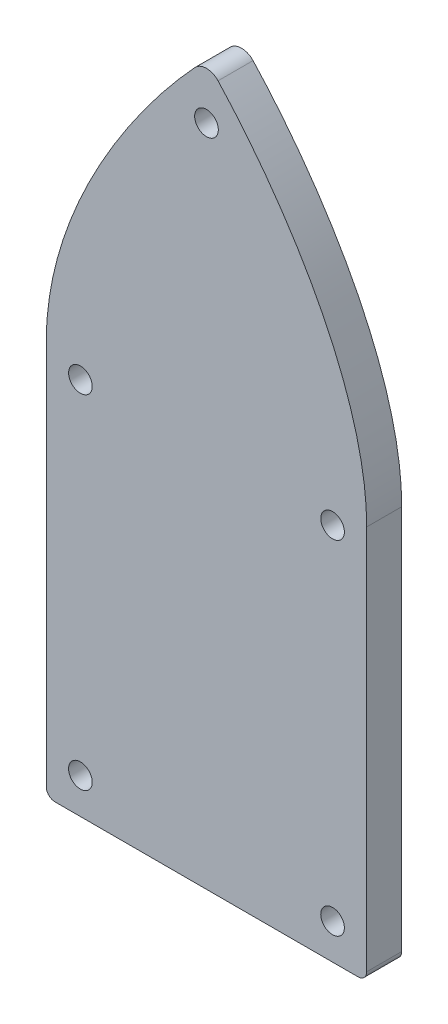
ISO-10303-21;
HEADER;
FILE_DESCRIPTION(('STEP AP214'),'2;1');
FILE_NAME('part.step','',(''),(''),'','','');
FILE_SCHEMA(('AUTOMOTIVE_DESIGN { 1 0 10303 214 1 1 1 1 }'));
ENDSEC;
DATA;
#1=APPLICATION_CONTEXT('core data for automotive mechanical design processes');
#2=APPLICATION_PROTOCOL_DEFINITION('international standard','automotive_design',2000,#1);
#3=PRODUCT_CONTEXT('',#1,'mechanical');
#4=PRODUCT('Part','Part','',(#3));
#5=PRODUCT_RELATED_PRODUCT_CATEGORY('part','',(#4));
#6=PRODUCT_DEFINITION_FORMATION('','',#4);
#7=PRODUCT_DEFINITION_CONTEXT('part definition',#1,'design');
#8=PRODUCT_DEFINITION('design','',#6,#7);
#9=PRODUCT_DEFINITION_SHAPE('','',#8);
#10=(LENGTH_UNIT() NAMED_UNIT(*) SI_UNIT(.MILLI.,.METRE.));
#11=(NAMED_UNIT(*) PLANE_ANGLE_UNIT() SI_UNIT($,.RADIAN.));
#12=(NAMED_UNIT(*) SI_UNIT($,.STERADIAN.) SOLID_ANGLE_UNIT());
#13=UNCERTAINTY_MEASURE_WITH_UNIT(LENGTH_MEASURE(1.E-05),#10,'distance_accuracy_value','');
#14=(GEOMETRIC_REPRESENTATION_CONTEXT(3) GLOBAL_UNCERTAINTY_ASSIGNED_CONTEXT((#13)) GLOBAL_UNIT_ASSIGNED_CONTEXT((#10,
#11,#12)) REPRESENTATION_CONTEXT('',''));
#15=CARTESIAN_POINT('',(0.,0.,0.));
#16=DIRECTION('',(0.,0.,1.));
#17=DIRECTION('',(1.,0.,0.));
#18=AXIS2_PLACEMENT_3D('',#15,#16,#17);
#19=CARTESIAN_POINT('',(-11.5364853865046,65.5385146134954,0.));
#20=DIRECTION('',(0.,0.,1.));
#21=DIRECTION('',(1.,0.,0.));
#22=AXIS2_PLACEMENT_3D('',#19,#20,#21);
#23=PLANE('',#22);
#24=CARTESIAN_POINT('',(-14.4,42.0178344238091,0.));
#25=DIRECTION('',(0.,0.,-1.));
#26=DIRECTION('',(-1.,0.,0.));
#27=AXIS2_PLACEMENT_3D('',#24,#25,#26);
#28=CIRCLE('',#27,2.5);
#29=CARTESIAN_POINT('',(-16.9,42.0178344238091,0.));
#30=VERTEX_POINT('',#29);
#31=EDGE_CURVE('E308',#30,#30,#28,.T.);
#32=ORIENTED_EDGE('',*,*,#31,.F.);
#33=EDGE_LOOP('',(#32));
#34=FACE_BOUND('',#33,.T.);
#35=CARTESIAN_POINT('',(0.,74.6,0.));
#36=DIRECTION('',(0.,0.,-1.));
#37=DIRECTION('',(-1.,0.,0.));
#38=AXIS2_PLACEMENT_3D('',#35,#36,#37);
#39=CIRCLE('',#38,2.5);
#40=CARTESIAN_POINT('',(-2.5,74.6,0.));
#41=VERTEX_POINT('',#40);
#42=EDGE_CURVE('E358',#41,#41,#39,.T.);
#43=ORIENTED_EDGE('',*,*,#42,.F.);
#44=EDGE_LOOP('',(#43));
#45=FACE_BOUND('',#44,.T.);
#46=DIRECTION('',(0.,1.,0.));
#47=VECTOR('',#46,1.);
#48=CARTESIAN_POINT('',(18.3,-1.2,0.));
#49=LINE('',#48,#47);
#50=CARTESIAN_POINT('',(18.3,-0.2,0.));
#51=VERTEX_POINT('',#50);
#52=CARTESIAN_POINT('',(18.3,43.8,0.));
#53=VERTEX_POINT('',#52);
#54=EDGE_CURVE('E226',#51,#53,#49,.T.);
#55=ORIENTED_EDGE('',*,*,#54,.F.);
#56=CARTESIAN_POINT('',(17.3,-0.2,0.));
#57=DIRECTION('',(0.,0.,1.));
#58=DIRECTION('',(1.,0.,0.));
#59=AXIS2_PLACEMENT_3D('',#56,#57,#58);
#60=CIRCLE('',#59,1.);
#61=CARTESIAN_POINT('',(17.3,-1.2,0.));
#62=VERTEX_POINT('',#61);
#63=EDGE_CURVE('E194',#51,#62,#60,.F.);
#64=ORIENTED_EDGE('',*,*,#63,.T.);
#65=DIRECTION('',(1.,0.,0.));
#66=VECTOR('',#65,1.);
#67=CARTESIAN_POINT('',(-18.3,-1.2,0.));
#68=LINE('',#67,#66);
#69=CARTESIAN_POINT('',(-17.3,-1.2,0.));
#70=VERTEX_POINT('',#69);
#71=EDGE_CURVE('E224',#70,#62,#68,.T.);
#72=ORIENTED_EDGE('',*,*,#71,.F.);
#73=CARTESIAN_POINT('',(-17.3,-0.2,0.));
#74=DIRECTION('',(0.,0.,1.));
#75=DIRECTION('',(1.,0.,0.));
#76=AXIS2_PLACEMENT_3D('',#73,#74,#75);
#77=CIRCLE('',#76,1.);
#78=CARTESIAN_POINT('',(-18.3,-0.2,0.));
#79=VERTEX_POINT('',#78);
#80=EDGE_CURVE('E192',#70,#79,#77,.F.);
#81=ORIENTED_EDGE('',*,*,#80,.T.);
#82=DIRECTION('',(0.,-1.,0.));
#83=VECTOR('',#82,1.);
#84=CARTESIAN_POINT('',(-18.3,-1.2,0.));
#85=LINE('',#84,#83);
#86=CARTESIAN_POINT('',(-18.3,43.8,0.));
#87=VERTEX_POINT('',#86);
#88=EDGE_CURVE('E229',#87,#79,#85,.T.);
#89=ORIENTED_EDGE('',*,*,#88,.F.);
#90=CARTESIAN_POINT('',(0.,80.8,0.));
#91=CARTESIAN_POINT('',(-6.36396103067883,74.4360389693211,0.));
#92=CARTESIAN_POINT('',(-18.3,58.8,0.));
#93=CARTESIAN_POINT('',(-18.3,43.8,0.));
#94=B_SPLINE_CURVE_WITH_KNOTS('',3,(#90,#91,#92,#93),.UNSPECIFIED.,.F.,.F.,(4,4),(0.,1.),.UNSPECIFIED.);
#95=CARTESIAN_POINT('',(-1.31719415240125,79.4330573062065,0.));
#96=VERTEX_POINT('',#95);
#97=EDGE_CURVE('E233',#96,#87,#94,.T.);
#98=ORIENTED_EDGE('',*,*,#97,.F.);
#99=CARTESIAN_POINT('',(0.,78.2062730689097,0.));
#100=DIRECTION('',(0.,0.,1.));
#101=DIRECTION('',(1.,0.,0.));
#102=AXIS2_PLACEMENT_3D('',#99,#100,#101);
#103=CIRCLE('',#102,1.8);
#104=CARTESIAN_POINT('',(1.31719415240124,79.4330573062065,0.));
#105=VERTEX_POINT('',#104);
#106=EDGE_CURVE('E179',#96,#105,#103,.F.);
#107=ORIENTED_EDGE('',*,*,#106,.T.);
#108=CARTESIAN_POINT('',(18.3,43.8,0.));
#109=CARTESIAN_POINT('',(18.3,58.8,0.));
#110=CARTESIAN_POINT('',(6.36396103067883,74.4360389693211,0.));
#111=CARTESIAN_POINT('',(0.,80.8,0.));
#112=B_SPLINE_CURVE_WITH_KNOTS('',3,(#108,#109,#110,#111),.UNSPECIFIED.,.F.,.F.,(4,4),(0.,1.),.UNSPECIFIED.);
#113=EDGE_CURVE('E231',#53,#105,#112,.T.);
#114=ORIENTED_EDGE('',*,*,#113,.F.);
#115=EDGE_LOOP('',(#55,#64,#72,#81,#89,#98,#107,#114));
#116=FACE_BOUND('',#115,.T.);
#117=CARTESIAN_POINT('',(14.4,42.0178344238091,0.));
#118=DIRECTION('',(0.,0.,-1.));
#119=DIRECTION('',(-1.,0.,0.));
#120=AXIS2_PLACEMENT_3D('',#117,#118,#119);
#121=CIRCLE('',#120,2.5);
#122=CARTESIAN_POINT('',(11.9,42.0178344238091,0.));
#123=VERTEX_POINT('',#122);
#124=EDGE_CURVE('E346',#123,#123,#121,.T.);
#125=ORIENTED_EDGE('',*,*,#124,.F.);
#126=EDGE_LOOP('',(#125));
#127=FACE_BOUND('',#126,.T.);
#128=CARTESIAN_POINT('',(14.4,2.86352117162364,0.));
#129=DIRECTION('',(0.,0.,-1.));
#130=DIRECTION('',(-1.,0.,0.));
#131=AXIS2_PLACEMENT_3D('',#128,#129,#130);
#132=CIRCLE('',#131,2.5);
#133=CARTESIAN_POINT('',(11.9,2.86352117162364,0.));
#134=VERTEX_POINT('',#133);
#135=EDGE_CURVE('E334',#134,#134,#132,.T.);
#136=ORIENTED_EDGE('',*,*,#135,.F.);
#137=EDGE_LOOP('',(#136));
#138=FACE_BOUND('',#137,.T.);
#139=CARTESIAN_POINT('',(-14.4,2.86352117162364,0.));
#140=DIRECTION('',(0.,0.,-1.));
#141=DIRECTION('',(-1.,0.,0.));
#142=AXIS2_PLACEMENT_3D('',#139,#140,#141);
#143=CIRCLE('',#142,2.5);
#144=CARTESIAN_POINT('',(-16.9,2.86352117162364,0.));
#145=VERTEX_POINT('',#144);
#146=EDGE_CURVE('E322',#145,#145,#143,.T.);
#147=ORIENTED_EDGE('',*,*,#146,.F.);
#148=EDGE_LOOP('',(#147));
#149=FACE_BOUND('',#148,.T.);
#150=DIRECTION('',(1.,0.,0.));
#151=VECTOR('',#150,1.);
#152=CARTESIAN_POINT('',(-11.5364853865046,29.3,0.));
#153=LINE('',#152,#151);
#154=CARTESIAN_POINT('',(3.,29.3,0.));
#155=VERTEX_POINT('',#154);
#156=CARTESIAN_POINT('',(7.,29.3,0.));
#157=VERTEX_POINT('',#156);
#158=EDGE_CURVE('E252',#155,#157,#153,.T.);
#159=ORIENTED_EDGE('',*,*,#158,.T.);
#160=DIRECTION('',(0.,-1.,0.));
#161=VECTOR('',#160,1.);
#162=CARTESIAN_POINT('',(7.,34.8,0.));
#163=LINE('',#162,#161);
#164=CARTESIAN_POINT('',(7.,50.3,0.));
#165=VERTEX_POINT('',#164);
#166=EDGE_CURVE('E292',#165,#157,#163,.T.);
#167=ORIENTED_EDGE('',*,*,#166,.F.);
#168=DIRECTION('',(1.,0.,0.));
#169=VECTOR('',#168,1.);
#170=CARTESIAN_POINT('',(-11.5364853865046,50.3,0.));
#171=LINE('',#170,#169);
#172=CARTESIAN_POINT('',(3.,50.3,0.));
#173=VERTEX_POINT('',#172);
#174=EDGE_CURVE('E249',#165,#173,#171,.F.);
#175=ORIENTED_EDGE('',*,*,#174,.T.);
#176=DIRECTION('',(0.,-1.,0.));
#177=VECTOR('',#176,1.);
#178=CARTESIAN_POINT('',(3.,34.8,0.));
#179=LINE('',#178,#177);
#180=EDGE_CURVE('E295',#173,#155,#179,.T.);
#181=ORIENTED_EDGE('',*,*,#180,.T.);
#182=EDGE_LOOP('',(#159,#167,#175,#181));
#183=FACE_BOUND('',#182,.T.);
#184=DIRECTION('',(0.,-1.,0.));
#185=VECTOR('',#184,1.);
#186=CARTESIAN_POINT('',(-7.,34.8,0.));
#187=LINE('',#186,#185);
#188=CARTESIAN_POINT('',(-7.,50.3,0.));
#189=VERTEX_POINT('',#188);
#190=CARTESIAN_POINT('',(-7.,29.3,0.));
#191=VERTEX_POINT('',#190);
#192=EDGE_CURVE('E275',#189,#191,#187,.T.);
#193=ORIENTED_EDGE('',*,*,#192,.T.);
#194=DIRECTION('',(-1.,0.,0.));
#195=VECTOR('',#194,1.);
#196=CARTESIAN_POINT('',(-3.,29.3,0.));
#197=LINE('',#196,#195);
#198=CARTESIAN_POINT('',(-3.,29.3,0.));
#199=VERTEX_POINT('',#198);
#200=EDGE_CURVE('E266',#191,#199,#197,.F.);
#201=ORIENTED_EDGE('',*,*,#200,.T.);
#202=DIRECTION('',(0.,-1.,0.));
#203=VECTOR('',#202,1.);
#204=CARTESIAN_POINT('',(-3.,34.8,0.));
#205=LINE('',#204,#203);
#206=CARTESIAN_POINT('',(-3.,50.3,0.));
#207=VERTEX_POINT('',#206);
#208=EDGE_CURVE('E161',#207,#199,#205,.T.);
#209=ORIENTED_EDGE('',*,*,#208,.F.);
#210=DIRECTION('',(-1.,0.,0.));
#211=VECTOR('',#210,1.);
#212=CARTESIAN_POINT('',(-7.,50.3,0.));
#213=LINE('',#212,#211);
#214=EDGE_CURVE('E174',#207,#189,#213,.T.);
#215=ORIENTED_EDGE('',*,*,#214,.T.);
#216=EDGE_LOOP('',(#193,#201,#209,#215));
#217=FACE_BOUND('',#216,.T.);
#218=ADVANCED_FACE('F33',(#34,#45,#116,#127,#138,#149,#183,#217),#23,.F.);
#219=CARTESIAN_POINT('',(-11.5364853865046,65.5385146134954,4.));
#220=DIRECTION('',(0.,0.,1.));
#221=DIRECTION('',(1.,0.,0.));
#222=AXIS2_PLACEMENT_3D('',#219,#220,#221);
#223=PLANE('',#222);
#224=CARTESIAN_POINT('',(0.,74.6,4.));
#225=DIRECTION('',(0.,0.,-1.));
#226=DIRECTION('',(-1.,0.,0.));
#227=AXIS2_PLACEMENT_3D('',#224,#225,#226);
#228=CIRCLE('',#227,1.35);
#229=CARTESIAN_POINT('',(-1.35,74.6,4.));
#230=VERTEX_POINT('',#229);
#231=EDGE_CURVE('E367',#230,#230,#228,.T.);
#232=ORIENTED_EDGE('',*,*,#231,.T.);
#233=EDGE_LOOP('',(#232));
#234=FACE_BOUND('',#233,.T.);
#235=DIRECTION('',(1.,0.,0.));
#236=VECTOR('',#235,1.);
#237=CARTESIAN_POINT('',(-18.3,-1.2,4.));
#238=LINE('',#237,#236);
#239=CARTESIAN_POINT('',(-17.3,-1.2,4.));
#240=VERTEX_POINT('',#239);
#241=CARTESIAN_POINT('',(17.3,-1.2,4.));
#242=VERTEX_POINT('',#241);
#243=EDGE_CURVE('E209',#240,#242,#238,.T.);
#244=ORIENTED_EDGE('',*,*,#243,.T.);
#245=CARTESIAN_POINT('',(17.3,-0.2,4.));
#246=DIRECTION('',(0.,0.,1.));
#247=DIRECTION('',(1.,0.,0.));
#248=AXIS2_PLACEMENT_3D('',#245,#246,#247);
#249=CIRCLE('',#248,1.);
#250=CARTESIAN_POINT('',(18.3,-0.2,4.));
#251=VERTEX_POINT('',#250);
#252=EDGE_CURVE('E41',#242,#251,#249,.T.);
#253=ORIENTED_EDGE('',*,*,#252,.T.);
#254=DIRECTION('',(0.,1.,0.));
#255=VECTOR('',#254,1.);
#256=CARTESIAN_POINT('',(18.3,-1.2,4.));
#257=LINE('',#256,#255);
#258=CARTESIAN_POINT('',(18.3,43.8,4.));
#259=VERTEX_POINT('',#258);
#260=EDGE_CURVE('E207',#251,#259,#257,.T.);
#261=ORIENTED_EDGE('',*,*,#260,.T.);
#262=CARTESIAN_POINT('',(18.3,43.8,4.));
#263=CARTESIAN_POINT('',(18.3,58.8,4.));
#264=CARTESIAN_POINT('',(6.36396103067883,74.4360389693211,4.));
#265=CARTESIAN_POINT('',(0.,80.8,4.));
#266=B_SPLINE_CURVE_WITH_KNOTS('',3,(#262,#263,#264,#265),.UNSPECIFIED.,.F.,.F.,(4,4),(0.,1.),.UNSPECIFIED.);
#267=CARTESIAN_POINT('',(1.31719415240124,79.4330573062065,4.));
#268=VERTEX_POINT('',#267);
#269=EDGE_CURVE('E218',#259,#268,#266,.T.);
#270=ORIENTED_EDGE('',*,*,#269,.T.);
#271=CARTESIAN_POINT('',(0.,78.2062730689097,4.));
#272=DIRECTION('',(0.,0.,1.));
#273=DIRECTION('',(1.,0.,0.));
#274=AXIS2_PLACEMENT_3D('',#271,#272,#273);
#275=CIRCLE('',#274,1.8);
#276=CARTESIAN_POINT('',(-1.31719415240125,79.4330573062065,4.));
#277=VERTEX_POINT('',#276);
#278=EDGE_CURVE('E187',#268,#277,#275,.T.);
#279=ORIENTED_EDGE('',*,*,#278,.T.);
#280=CARTESIAN_POINT('',(0.,80.8,4.));
#281=CARTESIAN_POINT('',(-6.36396103067883,74.4360389693211,4.));
#282=CARTESIAN_POINT('',(-18.3,58.8,4.));
#283=CARTESIAN_POINT('',(-18.3,43.8,4.));
#284=B_SPLINE_CURVE_WITH_KNOTS('',3,(#280,#281,#282,#283),.UNSPECIFIED.,.F.,.F.,(4,4),(0.,1.),.UNSPECIFIED.);
#285=CARTESIAN_POINT('',(-18.3,43.8,4.));
#286=VERTEX_POINT('',#285);
#287=EDGE_CURVE('E241',#277,#286,#284,.T.);
#288=ORIENTED_EDGE('',*,*,#287,.T.);
#289=DIRECTION('',(0.,-1.,0.));
#290=VECTOR('',#289,1.);
#291=CARTESIAN_POINT('',(-18.3,-1.2,4.));
#292=LINE('',#291,#290);
#293=CARTESIAN_POINT('',(-18.3,-0.2,4.));
#294=VERTEX_POINT('',#293);
#295=EDGE_CURVE('E374',#286,#294,#292,.T.);
#296=ORIENTED_EDGE('',*,*,#295,.T.);
#297=CARTESIAN_POINT('',(-17.3,-0.2,4.));
#298=DIRECTION('',(0.,0.,1.));
#299=DIRECTION('',(1.,0.,0.));
#300=AXIS2_PLACEMENT_3D('',#297,#298,#299);
#301=CIRCLE('',#300,1.);
#302=EDGE_CURVE('E200',#294,#240,#301,.T.);
#303=ORIENTED_EDGE('',*,*,#302,.T.);
#304=EDGE_LOOP('',(#244,#253,#261,#270,#279,#288,#296,#303));
#305=FACE_BOUND('',#304,.T.);
#306=CARTESIAN_POINT('',(14.4,42.0178344238091,4.));
#307=DIRECTION('',(0.,0.,-1.));
#308=DIRECTION('',(-1.,0.,0.));
#309=AXIS2_PLACEMENT_3D('',#306,#307,#308);
#310=CIRCLE('',#309,1.35);
#311=CARTESIAN_POINT('',(13.05,42.0178344238091,4.));
#312=VERTEX_POINT('',#311);
#313=EDGE_CURVE('E355',#312,#312,#310,.T.);
#314=ORIENTED_EDGE('',*,*,#313,.T.);
#315=EDGE_LOOP('',(#314));
#316=FACE_BOUND('',#315,.T.);
#317=CARTESIAN_POINT('',(14.4,2.86352117162364,4.));
#318=DIRECTION('',(0.,0.,-1.));
#319=DIRECTION('',(-1.,0.,0.));
#320=AXIS2_PLACEMENT_3D('',#317,#318,#319);
#321=CIRCLE('',#320,1.35);
#322=CARTESIAN_POINT('',(13.05,2.86352117162364,4.));
#323=VERTEX_POINT('',#322);
#324=EDGE_CURVE('E343',#323,#323,#321,.T.);
#325=ORIENTED_EDGE('',*,*,#324,.T.);
#326=EDGE_LOOP('',(#325));
#327=FACE_BOUND('',#326,.T.);
#328=CARTESIAN_POINT('',(-14.4,2.86352117162364,4.));
#329=DIRECTION('',(0.,0.,-1.));
#330=DIRECTION('',(-1.,0.,0.));
#331=AXIS2_PLACEMENT_3D('',#328,#329,#330);
#332=CIRCLE('',#331,1.35);
#333=CARTESIAN_POINT('',(-15.75,2.86352117162364,4.));
#334=VERTEX_POINT('',#333);
#335=EDGE_CURVE('E331',#334,#334,#332,.T.);
#336=ORIENTED_EDGE('',*,*,#335,.T.);
#337=EDGE_LOOP('',(#336));
#338=FACE_BOUND('',#337,.T.);
#339=CARTESIAN_POINT('',(-14.4,42.0178344238091,4.));
#340=DIRECTION('',(0.,0.,-1.));
#341=DIRECTION('',(-1.,0.,0.));
#342=AXIS2_PLACEMENT_3D('',#339,#340,#341);
#343=CIRCLE('',#342,1.35);
#344=CARTESIAN_POINT('',(-15.75,42.0178344238091,4.));
#345=VERTEX_POINT('',#344);
#346=EDGE_CURVE('E319',#345,#345,#343,.T.);
#347=ORIENTED_EDGE('',*,*,#346,.T.);
#348=EDGE_LOOP('',(#347));
#349=FACE_BOUND('',#348,.T.);
#350=ADVANCED_FACE('F204',(#234,#305,#316,#327,#338,#349),#223,.T.);
#351=DIRECTION('',(0.,0.,-1.));
#352=VECTOR('',#351,1.);
#353=SURFACE_OF_LINEAR_EXTRUSION('',#284,#352);
#354=ORIENTED_EDGE('',*,*,#287,.F.);
#355=DIRECTION('',(0.,0.,-1.));
#356=VECTOR('',#355,1.);
#357=CARTESIAN_POINT('',(-1.31719415240125,79.4330573062065,4.));
#358=LINE('',#357,#356);
#359=EDGE_CURVE('E175',#277,#96,#358,.T.);
#360=ORIENTED_EDGE('',*,*,#359,.T.);
#361=ORIENTED_EDGE('',*,*,#97,.T.);
#362=DIRECTION('',(0.,0.,-1.));
#363=VECTOR('',#362,1.);
#364=CARTESIAN_POINT('',(-18.3,43.8,4.));
#365=LINE('',#364,#363);
#366=EDGE_CURVE('E246',#286,#87,#365,.T.);
#367=ORIENTED_EDGE('',*,*,#366,.F.);
#368=EDGE_LOOP('',(#354,#360,#361,#367));
#369=FACE_BOUND('',#368,.T.);
#370=ADVANCED_FACE('F380',(#369),#353,.F.);
#371=CARTESIAN_POINT('',(-18.3,-1.2,4.));
#372=DIRECTION('',(1.,0.,0.));
#373=DIRECTION('',(0.,1.,0.));
#374=AXIS2_PLACEMENT_3D('',#371,#372,#373);
#375=PLANE('',#374);
#376=ORIENTED_EDGE('',*,*,#88,.T.);
#377=DIRECTION('',(0.,0.,-1.));
#378=VECTOR('',#377,1.);
#379=CARTESIAN_POINT('',(-18.3,-0.2,4.));
#380=LINE('',#379,#378);
#381=EDGE_CURVE('E11',#79,#294,#380,.F.);
#382=ORIENTED_EDGE('',*,*,#381,.T.);
#383=ORIENTED_EDGE('',*,*,#295,.F.);
#384=ORIENTED_EDGE('',*,*,#366,.T.);
#385=EDGE_LOOP('',(#376,#382,#383,#384));
#386=FACE_BOUND('',#385,.T.);
#387=ADVANCED_FACE('F384',(#386),#375,.F.);
#388=CARTESIAN_POINT('',(-18.3,-1.2,4.));
#389=DIRECTION('',(0.,1.,0.));
#390=DIRECTION('',(0.,0.,1.));
#391=AXIS2_PLACEMENT_3D('',#388,#389,#390);
#392=PLANE('',#391);
#393=ORIENTED_EDGE('',*,*,#71,.T.);
#394=DIRECTION('',(0.,0.,-1.));
#395=VECTOR('',#394,1.);
#396=CARTESIAN_POINT('',(17.3,-1.2,4.));
#397=LINE('',#396,#395);
#398=EDGE_CURVE('E54',#62,#242,#397,.F.);
#399=ORIENTED_EDGE('',*,*,#398,.T.);
#400=ORIENTED_EDGE('',*,*,#243,.F.);
#401=DIRECTION('',(0.,0.,-1.));
#402=VECTOR('',#401,1.);
#403=CARTESIAN_POINT('',(-17.3,-1.2,4.));
#404=LINE('',#403,#402);
#405=EDGE_CURVE('E196',#240,#70,#404,.T.);
#406=ORIENTED_EDGE('',*,*,#405,.T.);
#407=EDGE_LOOP('',(#393,#399,#400,#406));
#408=FACE_BOUND('',#407,.T.);
#409=ADVANCED_FACE('F227',(#408),#392,.F.);
#410=CARTESIAN_POINT('',(18.3,-1.2,4.));
#411=DIRECTION('',(-1.,0.,0.));
#412=DIRECTION('',(0.,-1.,0.));
#413=AXIS2_PLACEMENT_3D('',#410,#411,#412);
#414=PLANE('',#413);
#415=ORIENTED_EDGE('',*,*,#260,.F.);
#416=DIRECTION('',(0.,0.,-1.));
#417=VECTOR('',#416,1.);
#418=CARTESIAN_POINT('',(18.3,-0.2,4.));
#419=LINE('',#418,#417);
#420=EDGE_CURVE('E189',#251,#51,#419,.T.);
#421=ORIENTED_EDGE('',*,*,#420,.T.);
#422=ORIENTED_EDGE('',*,*,#54,.T.);
#423=DIRECTION('',(0.,0.,-1.));
#424=VECTOR('',#423,1.);
#425=CARTESIAN_POINT('',(18.3,43.8,4.));
#426=LINE('',#425,#424);
#427=EDGE_CURVE('E216',#259,#53,#426,.T.);
#428=ORIENTED_EDGE('',*,*,#427,.F.);
#429=EDGE_LOOP('',(#415,#421,#422,#428));
#430=FACE_BOUND('',#429,.T.);
#431=ADVANCED_FACE('F213',(#430),#414,.F.);
#432=DIRECTION('',(0.,0.,-1.));
#433=VECTOR('',#432,1.);
#434=SURFACE_OF_LINEAR_EXTRUSION('',#266,#433);
#435=ORIENTED_EDGE('',*,*,#113,.T.);
#436=DIRECTION('',(0.,0.,-1.));
#437=VECTOR('',#436,1.);
#438=CARTESIAN_POINT('',(1.31719415240124,79.4330573062065,0.));
#439=LINE('',#438,#437);
#440=EDGE_CURVE('E185',#105,#268,#439,.F.);
#441=ORIENTED_EDGE('',*,*,#440,.T.);
#442=ORIENTED_EDGE('',*,*,#269,.F.);
#443=ORIENTED_EDGE('',*,*,#427,.T.);
#444=EDGE_LOOP('',(#435,#441,#442,#443));
#445=FACE_BOUND('',#444,.T.);
#446=ADVANCED_FACE('F421',(#445),#434,.F.);
#447=CARTESIAN_POINT('',(0.,74.6,0.));
#448=DIRECTION('',(0.,0.,-1.));
#449=DIRECTION('',(-1.,0.,0.));
#450=AXIS2_PLACEMENT_3D('',#447,#448,#449);
#451=CYLINDRICAL_SURFACE('',#450,1.35);
#452=ORIENTED_EDGE('',*,*,#231,.F.);
#453=EDGE_LOOP('',(#452));
#454=FACE_BOUND('',#453,.T.);
#455=CARTESIAN_POINT('',(0.,74.6,2.));
#456=DIRECTION('',(0.,0.,-1.));
#457=DIRECTION('',(-1.,0.,0.));
#458=AXIS2_PLACEMENT_3D('',#455,#456,#457);
#459=CIRCLE('',#458,1.35);
#460=CARTESIAN_POINT('',(-1.35,74.6,2.));
#461=VERTEX_POINT('',#460);
#462=EDGE_CURVE('E364',#461,#461,#459,.T.);
#463=ORIENTED_EDGE('',*,*,#462,.T.);
#464=EDGE_LOOP('',(#463));
#465=FACE_BOUND('',#464,.T.);
#466=ADVANCED_FACE('F425',(#454,#465),#451,.F.);
#467=CARTESIAN_POINT('',(1.35,74.6,2.));
#468=DIRECTION('',(0.,0.,1.));
#469=DIRECTION('',(1.,0.,0.));
#470=AXIS2_PLACEMENT_3D('',#467,#468,#469);
#471=PLANE('',#470);
#472=ORIENTED_EDGE('',*,*,#462,.F.);
#473=EDGE_LOOP('',(#472));
#474=FACE_BOUND('',#473,.T.);
#475=CARTESIAN_POINT('',(0.,74.6,2.));
#476=DIRECTION('',(0.,0.,-1.));
#477=DIRECTION('',(-1.,0.,0.));
#478=AXIS2_PLACEMENT_3D('',#475,#476,#477);
#479=CIRCLE('',#478,2.5);
#480=CARTESIAN_POINT('',(-2.5,74.6,2.));
#481=VERTEX_POINT('',#480);
#482=EDGE_CURVE('E361',#481,#481,#479,.T.);
#483=ORIENTED_EDGE('',*,*,#482,.T.);
#484=EDGE_LOOP('',(#483));
#485=FACE_BOUND('',#484,.T.);
#486=ADVANCED_FACE('F467',(#474,#485),#471,.F.);
#487=CARTESIAN_POINT('',(0.,74.6,0.));
#488=DIRECTION('',(0.,0.,-1.));
#489=DIRECTION('',(-1.,0.,0.));
#490=AXIS2_PLACEMENT_3D('',#487,#488,#489);
#491=CYLINDRICAL_SURFACE('',#490,2.5);
#492=ORIENTED_EDGE('',*,*,#482,.F.);
#493=EDGE_LOOP('',(#492));
#494=FACE_BOUND('',#493,.T.);
#495=ORIENTED_EDGE('',*,*,#42,.T.);
#496=EDGE_LOOP('',(#495));
#497=FACE_BOUND('',#496,.T.);
#498=ADVANCED_FACE('F474',(#494,#497),#491,.F.);
#499=CARTESIAN_POINT('',(14.4,42.0178344238091,0.));
#500=DIRECTION('',(0.,0.,-1.));
#501=DIRECTION('',(-1.,0.,0.));
#502=AXIS2_PLACEMENT_3D('',#499,#500,#501);
#503=CYLINDRICAL_SURFACE('',#502,1.35);
#504=ORIENTED_EDGE('',*,*,#313,.F.);
#505=EDGE_LOOP('',(#504));
#506=FACE_BOUND('',#505,.T.);
#507=CARTESIAN_POINT('',(14.4,42.0178344238091,2.));
#508=DIRECTION('',(0.,0.,-1.));
#509=DIRECTION('',(-1.,0.,0.));
#510=AXIS2_PLACEMENT_3D('',#507,#508,#509);
#511=CIRCLE('',#510,1.35);
#512=CARTESIAN_POINT('',(13.05,42.0178344238091,2.));
#513=VERTEX_POINT('',#512);
#514=EDGE_CURVE('E352',#513,#513,#511,.T.);
#515=ORIENTED_EDGE('',*,*,#514,.T.);
#516=EDGE_LOOP('',(#515));
#517=FACE_BOUND('',#516,.T.);
#518=ADVANCED_FACE('F482',(#506,#517),#503,.F.);
#519=CARTESIAN_POINT('',(15.75,42.0178344238091,2.));
#520=DIRECTION('',(0.,0.,1.));
#521=DIRECTION('',(1.,0.,0.));
#522=AXIS2_PLACEMENT_3D('',#519,#520,#521);
#523=PLANE('',#522);
#524=ORIENTED_EDGE('',*,*,#514,.F.);
#525=EDGE_LOOP('',(#524));
#526=FACE_BOUND('',#525,.T.);
#527=CARTESIAN_POINT('',(14.4,42.0178344238091,2.));
#528=DIRECTION('',(0.,0.,-1.));
#529=DIRECTION('',(-1.,0.,0.));
#530=AXIS2_PLACEMENT_3D('',#527,#528,#529);
#531=CIRCLE('',#530,2.5);
#532=CARTESIAN_POINT('',(11.9,42.0178344238091,2.));
#533=VERTEX_POINT('',#532);
#534=EDGE_CURVE('E349',#533,#533,#531,.T.);
#535=ORIENTED_EDGE('',*,*,#534,.T.);
#536=EDGE_LOOP('',(#535));
#537=FACE_BOUND('',#536,.T.);
#538=ADVANCED_FACE('F490',(#526,#537),#523,.F.);
#539=CARTESIAN_POINT('',(14.4,42.0178344238091,0.));
#540=DIRECTION('',(0.,0.,-1.));
#541=DIRECTION('',(-1.,0.,0.));
#542=AXIS2_PLACEMENT_3D('',#539,#540,#541);
#543=CYLINDRICAL_SURFACE('',#542,2.5);
#544=ORIENTED_EDGE('',*,*,#534,.F.);
#545=EDGE_LOOP('',(#544));
#546=FACE_BOUND('',#545,.T.);
#547=ORIENTED_EDGE('',*,*,#124,.T.);
#548=EDGE_LOOP('',(#547));
#549=FACE_BOUND('',#548,.T.);
#550=ADVANCED_FACE('F498',(#546,#549),#543,.F.);
#551=CARTESIAN_POINT('',(14.4,2.86352117162364,0.));
#552=DIRECTION('',(0.,0.,-1.));
#553=DIRECTION('',(-1.,0.,0.));
#554=AXIS2_PLACEMENT_3D('',#551,#552,#553);
#555=CYLINDRICAL_SURFACE('',#554,1.35);
#556=ORIENTED_EDGE('',*,*,#324,.F.);
#557=EDGE_LOOP('',(#556));
#558=FACE_BOUND('',#557,.T.);
#559=CARTESIAN_POINT('',(14.4,2.86352117162364,2.));
#560=DIRECTION('',(0.,0.,-1.));
#561=DIRECTION('',(-1.,0.,0.));
#562=AXIS2_PLACEMENT_3D('',#559,#560,#561);
#563=CIRCLE('',#562,1.35);
#564=CARTESIAN_POINT('',(13.05,2.86352117162364,2.));
#565=VERTEX_POINT('',#564);
#566=EDGE_CURVE('E340',#565,#565,#563,.T.);
#567=ORIENTED_EDGE('',*,*,#566,.T.);
#568=EDGE_LOOP('',(#567));
#569=FACE_BOUND('',#568,.T.);
#570=ADVANCED_FACE('F506',(#558,#569),#555,.F.);
#571=CARTESIAN_POINT('',(15.75,2.86352117162364,2.));
#572=DIRECTION('',(0.,0.,1.));
#573=DIRECTION('',(1.,0.,0.));
#574=AXIS2_PLACEMENT_3D('',#571,#572,#573);
#575=PLANE('',#574);
#576=ORIENTED_EDGE('',*,*,#566,.F.);
#577=EDGE_LOOP('',(#576));
#578=FACE_BOUND('',#577,.T.);
#579=CARTESIAN_POINT('',(14.4,2.86352117162364,2.));
#580=DIRECTION('',(0.,0.,-1.));
#581=DIRECTION('',(-1.,0.,0.));
#582=AXIS2_PLACEMENT_3D('',#579,#580,#581);
#583=CIRCLE('',#582,2.5);
#584=CARTESIAN_POINT('',(11.9,2.86352117162364,2.));
#585=VERTEX_POINT('',#584);
#586=EDGE_CURVE('E337',#585,#585,#583,.T.);
#587=ORIENTED_EDGE('',*,*,#586,.T.);
#588=EDGE_LOOP('',(#587));
#589=FACE_BOUND('',#588,.T.);
#590=ADVANCED_FACE('F514',(#578,#589),#575,.F.);
#591=CARTESIAN_POINT('',(14.4,2.86352117162364,0.));
#592=DIRECTION('',(0.,0.,-1.));
#593=DIRECTION('',(-1.,0.,0.));
#594=AXIS2_PLACEMENT_3D('',#591,#592,#593);
#595=CYLINDRICAL_SURFACE('',#594,2.5);
#596=ORIENTED_EDGE('',*,*,#586,.F.);
#597=EDGE_LOOP('',(#596));
#598=FACE_BOUND('',#597,.T.);
#599=ORIENTED_EDGE('',*,*,#135,.T.);
#600=EDGE_LOOP('',(#599));
#601=FACE_BOUND('',#600,.T.);
#602=ADVANCED_FACE('F522',(#598,#601),#595,.F.);
#603=CARTESIAN_POINT('',(-14.4,2.86352117162364,0.));
#604=DIRECTION('',(0.,0.,-1.));
#605=DIRECTION('',(-1.,0.,0.));
#606=AXIS2_PLACEMENT_3D('',#603,#604,#605);
#607=CYLINDRICAL_SURFACE('',#606,1.35);
#608=ORIENTED_EDGE('',*,*,#335,.F.);
#609=EDGE_LOOP('',(#608));
#610=FACE_BOUND('',#609,.T.);
#611=CARTESIAN_POINT('',(-14.4,2.86352117162364,2.));
#612=DIRECTION('',(0.,0.,-1.));
#613=DIRECTION('',(-1.,0.,0.));
#614=AXIS2_PLACEMENT_3D('',#611,#612,#613);
#615=CIRCLE('',#614,1.35);
#616=CARTESIAN_POINT('',(-15.75,2.86352117162364,2.));
#617=VERTEX_POINT('',#616);
#618=EDGE_CURVE('E328',#617,#617,#615,.T.);
#619=ORIENTED_EDGE('',*,*,#618,.T.);
#620=EDGE_LOOP('',(#619));
#621=FACE_BOUND('',#620,.T.);
#622=ADVANCED_FACE('F530',(#610,#621),#607,.F.);
#623=CARTESIAN_POINT('',(-13.05,2.86352117162364,2.));
#624=DIRECTION('',(0.,0.,1.));
#625=DIRECTION('',(1.,0.,0.));
#626=AXIS2_PLACEMENT_3D('',#623,#624,#625);
#627=PLANE('',#626);
#628=ORIENTED_EDGE('',*,*,#618,.F.);
#629=EDGE_LOOP('',(#628));
#630=FACE_BOUND('',#629,.T.);
#631=CARTESIAN_POINT('',(-14.4,2.86352117162364,2.));
#632=DIRECTION('',(0.,0.,-1.));
#633=DIRECTION('',(-1.,0.,0.));
#634=AXIS2_PLACEMENT_3D('',#631,#632,#633);
#635=CIRCLE('',#634,2.5);
#636=CARTESIAN_POINT('',(-16.9,2.86352117162364,2.));
#637=VERTEX_POINT('',#636);
#638=EDGE_CURVE('E325',#637,#637,#635,.T.);
#639=ORIENTED_EDGE('',*,*,#638,.T.);
#640=EDGE_LOOP('',(#639));
#641=FACE_BOUND('',#640,.T.);
#642=ADVANCED_FACE('F538',(#630,#641),#627,.F.);
#643=CARTESIAN_POINT('',(-14.4,2.86352117162364,0.));
#644=DIRECTION('',(0.,0.,-1.));
#645=DIRECTION('',(-1.,0.,0.));
#646=AXIS2_PLACEMENT_3D('',#643,#644,#645);
#647=CYLINDRICAL_SURFACE('',#646,2.5);
#648=ORIENTED_EDGE('',*,*,#638,.F.);
#649=EDGE_LOOP('',(#648));
#650=FACE_BOUND('',#649,.T.);
#651=ORIENTED_EDGE('',*,*,#146,.T.);
#652=EDGE_LOOP('',(#651));
#653=FACE_BOUND('',#652,.T.);
#654=ADVANCED_FACE('F546',(#650,#653),#647,.F.);
#655=CARTESIAN_POINT('',(-14.4,42.0178344238091,0.));
#656=DIRECTION('',(0.,0.,-1.));
#657=DIRECTION('',(-1.,0.,0.));
#658=AXIS2_PLACEMENT_3D('',#655,#656,#657);
#659=CYLINDRICAL_SURFACE('',#658,1.35);
#660=ORIENTED_EDGE('',*,*,#346,.F.);
#661=EDGE_LOOP('',(#660));
#662=FACE_BOUND('',#661,.T.);
#663=CARTESIAN_POINT('',(-14.4,42.0178344238091,2.));
#664=DIRECTION('',(0.,0.,-1.));
#665=DIRECTION('',(-1.,0.,0.));
#666=AXIS2_PLACEMENT_3D('',#663,#664,#665);
#667=CIRCLE('',#666,1.35);
#668=CARTESIAN_POINT('',(-15.75,42.0178344238091,2.));
#669=VERTEX_POINT('',#668);
#670=EDGE_CURVE('E316',#669,#669,#667,.T.);
#671=ORIENTED_EDGE('',*,*,#670,.T.);
#672=EDGE_LOOP('',(#671));
#673=FACE_BOUND('',#672,.T.);
#674=ADVANCED_FACE('F554',(#662,#673),#659,.F.);
#675=CARTESIAN_POINT('',(-13.05,42.0178344238091,2.));
#676=DIRECTION('',(0.,0.,1.));
#677=DIRECTION('',(1.,0.,0.));
#678=AXIS2_PLACEMENT_3D('',#675,#676,#677);
#679=PLANE('',#678);
#680=ORIENTED_EDGE('',*,*,#670,.F.);
#681=EDGE_LOOP('',(#680));
#682=FACE_BOUND('',#681,.T.);
#683=CARTESIAN_POINT('',(-14.4,42.0178344238091,2.));
#684=DIRECTION('',(0.,0.,-1.));
#685=DIRECTION('',(-1.,0.,0.));
#686=AXIS2_PLACEMENT_3D('',#683,#684,#685);
#687=CIRCLE('',#686,2.5);
#688=CARTESIAN_POINT('',(-16.9,42.0178344238091,2.));
#689=VERTEX_POINT('',#688);
#690=EDGE_CURVE('E313',#689,#689,#687,.T.);
#691=ORIENTED_EDGE('',*,*,#690,.T.);
#692=EDGE_LOOP('',(#691));
#693=FACE_BOUND('',#692,.T.);
#694=ADVANCED_FACE('F562',(#682,#693),#679,.F.);
#695=CARTESIAN_POINT('',(-14.4,42.0178344238091,0.));
#696=DIRECTION('',(0.,0.,-1.));
#697=DIRECTION('',(-1.,0.,0.));
#698=AXIS2_PLACEMENT_3D('',#695,#696,#697);
#699=CYLINDRICAL_SURFACE('',#698,2.5);
#700=ORIENTED_EDGE('',*,*,#690,.F.);
#701=EDGE_LOOP('',(#700));
#702=FACE_BOUND('',#701,.T.);
#703=ORIENTED_EDGE('',*,*,#31,.T.);
#704=EDGE_LOOP('',(#703));
#705=FACE_BOUND('',#704,.T.);
#706=ADVANCED_FACE('F570',(#702,#705),#699,.F.);
#707=CARTESIAN_POINT('',(3.,39.8,-5.5));
#708=DIRECTION('',(1.,0.,0.));
#709=DIRECTION('',(0.,0.,-1.));
#710=AXIS2_PLACEMENT_3D('',#707,#708,#709);
#711=CYLINDRICAL_SURFACE('',#710,5.);
#712=CARTESIAN_POINT('',(7.,39.8,-5.5));
#713=DIRECTION('',(1.,0.,0.));
#714=DIRECTION('',(0.,0.,1.));
#715=AXIS2_PLACEMENT_3D('',#712,#713,#714);
#716=CIRCLE('',#715,5.);
#717=CARTESIAN_POINT('',(7.,34.8,-5.5));
#718=VERTEX_POINT('',#717);
#719=CARTESIAN_POINT('',(7.,44.8,-5.5));
#720=VERTEX_POINT('',#719);
#721=EDGE_CURVE('E298',#718,#720,#716,.T.);
#722=ORIENTED_EDGE('',*,*,#721,.F.);
#723=DIRECTION('',(1.,0.,0.));
#724=VECTOR('',#723,1.);
#725=CARTESIAN_POINT('',(3.,34.8,-5.5));
#726=LINE('',#725,#724);
#727=CARTESIAN_POINT('',(3.,34.8,-5.5));
#728=VERTEX_POINT('',#727);
#729=EDGE_CURVE('E301',#728,#718,#726,.T.);
#730=ORIENTED_EDGE('',*,*,#729,.F.);
#731=CARTESIAN_POINT('',(3.,39.8,-5.5));
#732=DIRECTION('',(1.,0.,0.));
#733=DIRECTION('',(0.,0.,1.));
#734=AXIS2_PLACEMENT_3D('',#731,#732,#733);
#735=CIRCLE('',#734,5.);
#736=CARTESIAN_POINT('',(3.,44.8,-5.5));
#737=VERTEX_POINT('',#736);
#738=EDGE_CURVE('E297',#728,#737,#735,.T.);
#739=ORIENTED_EDGE('',*,*,#738,.T.);
#740=DIRECTION('',(1.,0.,0.));
#741=VECTOR('',#740,1.);
#742=CARTESIAN_POINT('',(3.,44.8,-5.5));
#743=LINE('',#742,#741);
#744=EDGE_CURVE('E305',#737,#720,#743,.T.);
#745=ORIENTED_EDGE('',*,*,#744,.T.);
#746=EDGE_LOOP('',(#722,#730,#739,#745));
#747=FACE_BOUND('',#746,.T.);
#748=ADVANCED_FACE('F578',(#747),#711,.T.);
#749=CARTESIAN_POINT('',(3.,39.8,-5.5));
#750=DIRECTION('',(-1.,0.,0.));
#751=DIRECTION('',(0.,0.,1.));
#752=AXIS2_PLACEMENT_3D('',#749,#750,#751);
#753=PLANE('',#752);
#754=CARTESIAN_POINT('',(3.,39.8,-5.5));
#755=DIRECTION('',(1.,0.,0.));
#756=DIRECTION('',(0.,0.,-1.));
#757=AXIS2_PLACEMENT_3D('',#754,#755,#756);
#758=CIRCLE('',#757,1.75);
#759=CARTESIAN_POINT('',(3.,39.8,-7.25));
#760=VERTEX_POINT('',#759);
#761=EDGE_CURVE('E289',#760,#760,#758,.T.);
#762=ORIENTED_EDGE('',*,*,#761,.T.);
#763=EDGE_LOOP('',(#762));
#764=FACE_BOUND('',#763,.T.);
#765=ORIENTED_EDGE('',*,*,#180,.F.);
#766=CARTESIAN_POINT('',(3.,50.3,-5.5));
#767=DIRECTION('',(-1.,0.,0.));
#768=DIRECTION('',(0.,0.,1.));
#769=AXIS2_PLACEMENT_3D('',#766,#767,#768);
#770=CIRCLE('',#769,5.5);
#771=EDGE_CURVE('E263',#173,#737,#770,.F.);
#772=ORIENTED_EDGE('',*,*,#771,.T.);
#773=ORIENTED_EDGE('',*,*,#738,.F.);
#774=CARTESIAN_POINT('',(3.,29.3,-5.5));
#775=DIRECTION('',(-1.,0.,0.));
#776=DIRECTION('',(0.,0.,1.));
#777=AXIS2_PLACEMENT_3D('',#774,#775,#776);
#778=CIRCLE('',#777,5.5);
#779=EDGE_CURVE('E257',#728,#155,#778,.F.);
#780=ORIENTED_EDGE('',*,*,#779,.T.);
#781=EDGE_LOOP('',(#765,#772,#773,#780));
#782=FACE_BOUND('',#781,.T.);
#783=ADVANCED_FACE('F587',(#764,#782),#753,.T.);
#784=CARTESIAN_POINT('',(7.,39.8,-5.5));
#785=DIRECTION('',(-1.,0.,0.));
#786=DIRECTION('',(0.,0.,1.));
#787=AXIS2_PLACEMENT_3D('',#784,#785,#786);
#788=PLANE('',#787);
#789=CARTESIAN_POINT('',(7.,39.8,-5.5));
#790=DIRECTION('',(1.,0.,0.));
#791=DIRECTION('',(0.,0.,-1.));
#792=AXIS2_PLACEMENT_3D('',#789,#790,#791);
#793=CIRCLE('',#792,1.75);
#794=CARTESIAN_POINT('',(7.,39.8,-7.25));
#795=VERTEX_POINT('',#794);
#796=EDGE_CURVE('E287',#795,#795,#793,.T.);
#797=ORIENTED_EDGE('',*,*,#796,.F.);
#798=EDGE_LOOP('',(#797));
#799=FACE_BOUND('',#798,.T.);
#800=ORIENTED_EDGE('',*,*,#166,.T.);
#801=CARTESIAN_POINT('',(7.,29.3,-5.5));
#802=DIRECTION('',(-1.,0.,0.));
#803=DIRECTION('',(0.,0.,1.));
#804=AXIS2_PLACEMENT_3D('',#801,#802,#803);
#805=CIRCLE('',#804,5.5);
#806=EDGE_CURVE('E255',#157,#718,#805,.T.);
#807=ORIENTED_EDGE('',*,*,#806,.T.);
#808=ORIENTED_EDGE('',*,*,#721,.T.);
#809=CARTESIAN_POINT('',(7.,50.3,-5.5));
#810=DIRECTION('',(-1.,0.,0.));
#811=DIRECTION('',(0.,0.,1.));
#812=AXIS2_PLACEMENT_3D('',#809,#810,#811);
#813=CIRCLE('',#812,5.5);
#814=EDGE_CURVE('E260',#720,#165,#813,.T.);
#815=ORIENTED_EDGE('',*,*,#814,.T.);
#816=EDGE_LOOP('',(#800,#807,#808,#815));
#817=FACE_BOUND('',#816,.T.);
#818=ADVANCED_FACE('F595',(#799,#817),#788,.F.);
#819=CARTESIAN_POINT('',(3.,39.8,-5.5));
#820=DIRECTION('',(1.,0.,0.));
#821=DIRECTION('',(0.,0.,-1.));
#822=AXIS2_PLACEMENT_3D('',#819,#820,#821);
#823=CYLINDRICAL_SURFACE('',#822,1.75);
#824=ORIENTED_EDGE('',*,*,#761,.F.);
#825=EDGE_LOOP('',(#824));
#826=FACE_BOUND('',#825,.T.);
#827=ORIENTED_EDGE('',*,*,#796,.T.);
#828=EDGE_LOOP('',(#827));
#829=FACE_BOUND('',#828,.T.);
#830=ADVANCED_FACE('F391',(#826,#829),#823,.F.);
#831=CARTESIAN_POINT('',(-11.5364853865046,29.3,-5.5));
#832=DIRECTION('',(1.,0.,0.));
#833=DIRECTION('',(0.,0.,-1.));
#834=AXIS2_PLACEMENT_3D('',#831,#832,#833);
#835=CYLINDRICAL_SURFACE('',#834,5.5);
#836=ORIENTED_EDGE('',*,*,#779,.F.);
#837=ORIENTED_EDGE('',*,*,#729,.T.);
#838=ORIENTED_EDGE('',*,*,#806,.F.);
#839=ORIENTED_EDGE('',*,*,#158,.F.);
#840=EDGE_LOOP('',(#836,#837,#838,#839));
#841=FACE_BOUND('',#840,.T.);
#842=ADVANCED_FACE('F387',(#841),#835,.F.);
#843=CARTESIAN_POINT('',(3.,50.3,-5.5));
#844=DIRECTION('',(1.,0.,0.));
#845=DIRECTION('',(0.,0.,-1.));
#846=AXIS2_PLACEMENT_3D('',#843,#844,#845);
#847=CYLINDRICAL_SURFACE('',#846,5.5);
#848=ORIENTED_EDGE('',*,*,#771,.F.);
#849=ORIENTED_EDGE('',*,*,#174,.F.);
#850=ORIENTED_EDGE('',*,*,#814,.F.);
#851=ORIENTED_EDGE('',*,*,#744,.F.);
#852=EDGE_LOOP('',(#848,#849,#850,#851));
#853=FACE_BOUND('',#852,.T.);
#854=ADVANCED_FACE('F390',(#853),#847,.F.);
#855=CARTESIAN_POINT('',(-3.,39.8,-5.5));
#856=DIRECTION('',(1.,0.,0.));
#857=DIRECTION('',(0.,0.,1.));
#858=AXIS2_PLACEMENT_3D('',#855,#856,#857);
#859=PLANE('',#858);
#860=ORIENTED_EDGE('',*,*,#208,.T.);
#861=CARTESIAN_POINT('',(-3.,29.3,-5.5));
#862=DIRECTION('',(1.,0.,0.));
#863=DIRECTION('',(0.,0.,-1.));
#864=AXIS2_PLACEMENT_3D('',#861,#862,#863);
#865=CIRCLE('',#864,5.5);
#866=CARTESIAN_POINT('',(-3.,34.8,-5.5));
#867=VERTEX_POINT('',#866);
#868=EDGE_CURVE('E156',#199,#867,#865,.F.);
#869=ORIENTED_EDGE('',*,*,#868,.T.);
#870=CARTESIAN_POINT('',(-3.,39.8,-5.5));
#871=DIRECTION('',(1.,0.,0.));
#872=DIRECTION('',(0.,0.,1.));
#873=AXIS2_PLACEMENT_3D('',#870,#871,#872);
#874=CIRCLE('',#873,5.);
#875=CARTESIAN_POINT('',(-3.,44.8,-5.5));
#876=VERTEX_POINT('',#875);
#877=EDGE_CURVE('E148',#867,#876,#874,.T.);
#878=ORIENTED_EDGE('',*,*,#877,.T.);
#879=CARTESIAN_POINT('',(-3.,50.3,-5.5));
#880=DIRECTION('',(1.,0.,0.));
#881=DIRECTION('',(0.,0.,-1.));
#882=AXIS2_PLACEMENT_3D('',#879,#880,#881);
#883=CIRCLE('',#882,5.5);
#884=EDGE_CURVE('E153',#876,#207,#883,.F.);
#885=ORIENTED_EDGE('',*,*,#884,.T.);
#886=EDGE_LOOP('',(#860,#869,#878,#885));
#887=FACE_BOUND('',#886,.T.);
#888=CARTESIAN_POINT('',(-3.,39.8,-5.5));
#889=DIRECTION('',(1.,0.,0.));
#890=DIRECTION('',(0.,0.,-1.));
#891=AXIS2_PLACEMENT_3D('',#888,#889,#890);
#892=CIRCLE('',#891,1.75);
#893=CARTESIAN_POINT('',(-3.,39.8,-7.25));
#894=VERTEX_POINT('',#893);
#895=EDGE_CURVE('E279',#894,#894,#892,.T.);
#896=ORIENTED_EDGE('',*,*,#895,.F.);
#897=EDGE_LOOP('',(#896));
#898=FACE_BOUND('',#897,.T.);
#899=ADVANCED_FACE('F150',(#887,#898),#859,.T.);
#900=CARTESIAN_POINT('',(-7.,39.8,-5.5));
#901=DIRECTION('',(1.,0.,0.));
#902=DIRECTION('',(0.,0.,1.));
#903=AXIS2_PLACEMENT_3D('',#900,#901,#902);
#904=PLANE('',#903);
#905=ORIENTED_EDGE('',*,*,#192,.F.);
#906=CARTESIAN_POINT('',(-7.,50.3,-5.5));
#907=DIRECTION('',(1.,0.,0.));
#908=DIRECTION('',(0.,0.,-1.));
#909=AXIS2_PLACEMENT_3D('',#906,#907,#908);
#910=CIRCLE('',#909,5.5);
#911=CARTESIAN_POINT('',(-7.,44.8,-5.5));
#912=VERTEX_POINT('',#911);
#913=EDGE_CURVE('E176',#189,#912,#910,.T.);
#914=ORIENTED_EDGE('',*,*,#913,.T.);
#915=CARTESIAN_POINT('',(-7.,39.8,-5.5));
#916=DIRECTION('',(1.,0.,0.));
#917=DIRECTION('',(0.,0.,1.));
#918=AXIS2_PLACEMENT_3D('',#915,#916,#917);
#919=CIRCLE('',#918,5.);
#920=CARTESIAN_POINT('',(-7.,34.8,-5.5));
#921=VERTEX_POINT('',#920);
#922=EDGE_CURVE('E167',#921,#912,#919,.T.);
#923=ORIENTED_EDGE('',*,*,#922,.F.);
#924=CARTESIAN_POINT('',(-7.,29.3,-5.5));
#925=DIRECTION('',(1.,0.,0.));
#926=DIRECTION('',(0.,0.,-1.));
#927=AXIS2_PLACEMENT_3D('',#924,#925,#926);
#928=CIRCLE('',#927,5.5);
#929=EDGE_CURVE('E269',#921,#191,#928,.T.);
#930=ORIENTED_EDGE('',*,*,#929,.T.);
#931=EDGE_LOOP('',(#905,#914,#923,#930));
#932=FACE_BOUND('',#931,.T.);
#933=CARTESIAN_POINT('',(-7.,39.8,-5.5));
#934=DIRECTION('',(1.,0.,0.));
#935=DIRECTION('',(0.,0.,-1.));
#936=AXIS2_PLACEMENT_3D('',#933,#934,#935);
#937=CIRCLE('',#936,1.75);
#938=CARTESIAN_POINT('',(-7.,39.8,-7.25));
#939=VERTEX_POINT('',#938);
#940=EDGE_CURVE('E283',#939,#939,#937,.T.);
#941=ORIENTED_EDGE('',*,*,#940,.T.);
#942=EDGE_LOOP('',(#941));
#943=FACE_BOUND('',#942,.T.);
#944=ADVANCED_FACE('F273',(#932,#943),#904,.F.);
#945=CARTESIAN_POINT('',(-3.,39.8,-5.5));
#946=DIRECTION('',(-1.,0.,0.));
#947=DIRECTION('',(0.,0.,1.));
#948=AXIS2_PLACEMENT_3D('',#945,#946,#947);
#949=CYLINDRICAL_SURFACE('',#948,5.);
#950=ORIENTED_EDGE('',*,*,#922,.T.);
#951=DIRECTION('',(-1.,0.,0.));
#952=VECTOR('',#951,1.);
#953=CARTESIAN_POINT('',(-3.,44.8,-5.5));
#954=LINE('',#953,#952);
#955=EDGE_CURVE('E160',#876,#912,#954,.T.);
#956=ORIENTED_EDGE('',*,*,#955,.F.);
#957=ORIENTED_EDGE('',*,*,#877,.F.);
#958=DIRECTION('',(-1.,0.,0.));
#959=VECTOR('',#958,1.);
#960=CARTESIAN_POINT('',(-3.,34.8,-5.5));
#961=LINE('',#960,#959);
#962=EDGE_CURVE('E170',#867,#921,#961,.T.);
#963=ORIENTED_EDGE('',*,*,#962,.T.);
#964=EDGE_LOOP('',(#950,#956,#957,#963));
#965=FACE_BOUND('',#964,.T.);
#966=ADVANCED_FACE('F165',(#965),#949,.T.);
#967=CARTESIAN_POINT('',(-3.,39.8,-5.5));
#968=DIRECTION('',(-1.,0.,0.));
#969=DIRECTION('',(0.,0.,1.));
#970=AXIS2_PLACEMENT_3D('',#967,#968,#969);
#971=CYLINDRICAL_SURFACE('',#970,1.75);
#972=ORIENTED_EDGE('',*,*,#895,.T.);
#973=EDGE_LOOP('',(#972));
#974=FACE_BOUND('',#973,.T.);
#975=ORIENTED_EDGE('',*,*,#940,.F.);
#976=EDGE_LOOP('',(#975));
#977=FACE_BOUND('',#976,.T.);
#978=ADVANCED_FACE('F398',(#974,#977),#971,.F.);
#979=CARTESIAN_POINT('',(-3.,29.3,-5.5));
#980=DIRECTION('',(1.,0.,0.));
#981=DIRECTION('',(0.,0.,-1.));
#982=AXIS2_PLACEMENT_3D('',#979,#980,#981);
#983=CYLINDRICAL_SURFACE('',#982,5.5);
#984=ORIENTED_EDGE('',*,*,#868,.F.);
#985=ORIENTED_EDGE('',*,*,#200,.F.);
#986=ORIENTED_EDGE('',*,*,#929,.F.);
#987=ORIENTED_EDGE('',*,*,#962,.F.);
#988=EDGE_LOOP('',(#984,#985,#986,#987));
#989=FACE_BOUND('',#988,.T.);
#990=ADVANCED_FACE('F277',(#989),#983,.F.);
#991=CARTESIAN_POINT('',(-11.5364853865046,50.3,-5.5));
#992=DIRECTION('',(1.,0.,0.));
#993=DIRECTION('',(0.,0.,-1.));
#994=AXIS2_PLACEMENT_3D('',#991,#992,#993);
#995=CYLINDRICAL_SURFACE('',#994,5.5);
#996=ORIENTED_EDGE('',*,*,#884,.F.);
#997=ORIENTED_EDGE('',*,*,#955,.T.);
#998=ORIENTED_EDGE('',*,*,#913,.F.);
#999=ORIENTED_EDGE('',*,*,#214,.F.);
#1000=EDGE_LOOP('',(#996,#997,#998,#999));
#1001=FACE_BOUND('',#1000,.T.);
#1002=ADVANCED_FACE('F172',(#1001),#995,.F.);
#1003=CARTESIAN_POINT('',(0.,78.2062730689097,2.));
#1004=DIRECTION('',(0.,0.,-1.));
#1005=DIRECTION('',(-1.,0.,0.));
#1006=AXIS2_PLACEMENT_3D('',#1003,#1004,#1005);
#1007=CYLINDRICAL_SURFACE('',#1006,1.8);
#1008=ORIENTED_EDGE('',*,*,#278,.F.);
#1009=ORIENTED_EDGE('',*,*,#440,.F.);
#1010=ORIENTED_EDGE('',*,*,#106,.F.);
#1011=ORIENTED_EDGE('',*,*,#359,.F.);
#1012=EDGE_LOOP('',(#1008,#1009,#1010,#1011));
#1013=FACE_BOUND('',#1012,.T.);
#1014=ADVANCED_FACE('F401',(#1013),#1007,.T.);
#1015=CARTESIAN_POINT('',(17.3,-0.2,4.));
#1016=DIRECTION('',(0.,0.,-1.));
#1017=DIRECTION('',(-1.,0.,0.));
#1018=AXIS2_PLACEMENT_3D('',#1015,#1016,#1017);
#1019=CYLINDRICAL_SURFACE('',#1018,1.);
#1020=ORIENTED_EDGE('',*,*,#252,.F.);
#1021=ORIENTED_EDGE('',*,*,#398,.F.);
#1022=ORIENTED_EDGE('',*,*,#63,.F.);
#1023=ORIENTED_EDGE('',*,*,#420,.F.);
#1024=EDGE_LOOP('',(#1020,#1021,#1022,#1023));
#1025=FACE_BOUND('',#1024,.T.);
#1026=ADVANCED_FACE('F220',(#1025),#1019,.T.);
#1027=CARTESIAN_POINT('',(-17.3,-0.2,4.));
#1028=DIRECTION('',(0.,0.,-1.));
#1029=DIRECTION('',(-1.,0.,0.));
#1030=AXIS2_PLACEMENT_3D('',#1027,#1028,#1029);
#1031=CYLINDRICAL_SURFACE('',#1030,1.);
#1032=ORIENTED_EDGE('',*,*,#302,.F.);
#1033=ORIENTED_EDGE('',*,*,#381,.F.);
#1034=ORIENTED_EDGE('',*,*,#80,.F.);
#1035=ORIENTED_EDGE('',*,*,#405,.F.);
#1036=EDGE_LOOP('',(#1032,#1033,#1034,#1035));
#1037=FACE_BOUND('',#1036,.T.);
#1038=ADVANCED_FACE('F35',(#1037),#1031,.T.);
#1039=CLOSED_SHELL('',(#218,#350,#370,#387,#409,#431,#446,#466,#486,#498,#518,#538,#550,#570,
#590,#602,#622,#642,#654,#674,#694,#706,#748,#783,#818,#830,#842,#854,#899,#944,#966,#978,#990,
#1002,#1014,#1026,#1038));
#1040=MANIFOLD_SOLID_BREP('B2',#1039);
#1041=ADVANCED_BREP_SHAPE_REPRESENTATION('',(#18,#1040),#14);
#1042=SHAPE_DEFINITION_REPRESENTATION(#9,#1041);
ENDSEC;
END-ISO-10303-21;
